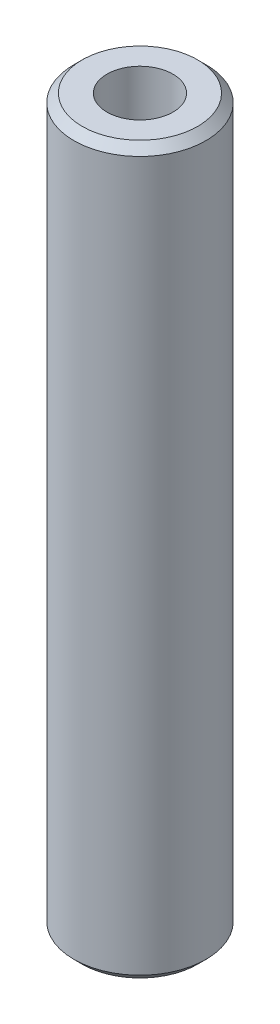
ISO-10303-21;
HEADER;
FILE_DESCRIPTION(('STEP AP214'),'2;1');
FILE_NAME('part.step','',(''),(''),'','','');
FILE_SCHEMA(('AUTOMOTIVE_DESIGN { 1 0 10303 214 1 1 1 1 }'));
ENDSEC;
DATA;
#1=APPLICATION_CONTEXT('core data for automotive mechanical design processes');
#2=APPLICATION_PROTOCOL_DEFINITION('international standard','automotive_design',2000,#1);
#3=PRODUCT_CONTEXT('',#1,'mechanical');
#4=PRODUCT('Part','Part','',(#3));
#5=PRODUCT_RELATED_PRODUCT_CATEGORY('part','',(#4));
#6=PRODUCT_DEFINITION_FORMATION('','',#4);
#7=PRODUCT_DEFINITION_CONTEXT('part definition',#1,'design');
#8=PRODUCT_DEFINITION('design','',#6,#7);
#9=PRODUCT_DEFINITION_SHAPE('','',#8);
#10=(LENGTH_UNIT() NAMED_UNIT(*) SI_UNIT(.MILLI.,.METRE.));
#11=(NAMED_UNIT(*) PLANE_ANGLE_UNIT() SI_UNIT($,.RADIAN.));
#12=(NAMED_UNIT(*) SI_UNIT($,.STERADIAN.) SOLID_ANGLE_UNIT());
#13=UNCERTAINTY_MEASURE_WITH_UNIT(LENGTH_MEASURE(1.E-05),#10,'distance_accuracy_value','');
#14=(GEOMETRIC_REPRESENTATION_CONTEXT(3) GLOBAL_UNCERTAINTY_ASSIGNED_CONTEXT((#13)) GLOBAL_UNIT_ASSIGNED_CONTEXT((#10,
#11,#12)) REPRESENTATION_CONTEXT('',''));
#15=CARTESIAN_POINT('',(0.,0.,0.));
#16=DIRECTION('',(0.,0.,1.));
#17=DIRECTION('',(1.,0.,0.));
#18=AXIS2_PLACEMENT_3D('',#15,#16,#17);
#19=CARTESIAN_POINT('',(0.,44.,0.));
#20=DIRECTION('',(0.,1.,0.));
#21=DIRECTION('',(0.,0.,1.));
#22=AXIS2_PLACEMENT_3D('',#19,#20,#21);
#23=PLANE('',#22);
#24=CARTESIAN_POINT('',(0.,44.,0.));
#25=DIRECTION('',(0.,1.,0.));
#26=DIRECTION('',(0.,0.,1.));
#27=AXIS2_PLACEMENT_3D('',#24,#25,#26);
#28=CIRCLE('',#27,3.5);
#29=CARTESIAN_POINT('',(0.,44.,3.5));
#30=VERTEX_POINT('',#29);
#31=EDGE_CURVE('E10',#30,#30,#28,.T.);
#32=ORIENTED_EDGE('',*,*,#31,.T.);
#33=EDGE_LOOP('',(#32));
#34=FACE_BOUND('',#33,.T.);
#35=CARTESIAN_POINT('',(0.,44.,0.));
#36=DIRECTION('',(0.,1.,0.));
#37=DIRECTION('',(0.,0.,1.));
#38=AXIS2_PLACEMENT_3D('',#35,#36,#37);
#39=CIRCLE('',#38,2.);
#40=CARTESIAN_POINT('',(0.,44.,2.));
#41=VERTEX_POINT('',#40);
#42=EDGE_CURVE('E60',#41,#41,#39,.T.);
#43=ORIENTED_EDGE('',*,*,#42,.F.);
#44=EDGE_LOOP('',(#43));
#45=FACE_BOUND('',#44,.T.);
#46=ADVANCED_FACE('F39',(#34,#45),#23,.T.);
#47=CARTESIAN_POINT('',(0.,0.,0.));
#48=DIRECTION('',(0.,1.,0.));
#49=DIRECTION('',(0.,0.,1.));
#50=AXIS2_PLACEMENT_3D('',#47,#48,#49);
#51=PLANE('',#50);
#52=CARTESIAN_POINT('',(0.,0.,0.));
#53=DIRECTION('',(0.,1.,0.));
#54=DIRECTION('',(0.,0.,1.));
#55=AXIS2_PLACEMENT_3D('',#52,#53,#54);
#56=CIRCLE('',#55,3.5);
#57=CARTESIAN_POINT('',(0.,0.,3.5));
#58=VERTEX_POINT('',#57);
#59=EDGE_CURVE('E47',#58,#58,#56,.F.);
#60=ORIENTED_EDGE('',*,*,#59,.T.);
#61=EDGE_LOOP('',(#60));
#62=FACE_BOUND('',#61,.T.);
#63=CARTESIAN_POINT('',(0.,0.,0.));
#64=DIRECTION('',(0.,1.,0.));
#65=DIRECTION('',(0.,0.,1.));
#66=AXIS2_PLACEMENT_3D('',#63,#64,#65);
#67=CIRCLE('',#66,2.);
#68=CARTESIAN_POINT('',(0.,0.,2.));
#69=VERTEX_POINT('',#68);
#70=EDGE_CURVE('E61',#69,#69,#67,.T.);
#71=ORIENTED_EDGE('',*,*,#70,.T.);
#72=EDGE_LOOP('',(#71));
#73=FACE_BOUND('',#72,.T.);
#74=ADVANCED_FACE('F71',(#62,#73),#51,.F.);
#75=CARTESIAN_POINT('',(0.,44.,0.));
#76=DIRECTION('',(0.,-1.,0.));
#77=DIRECTION('',(0.,0.,-1.));
#78=AXIS2_PLACEMENT_3D('',#75,#76,#77);
#79=CYLINDRICAL_SURFACE('',#78,4.);
#80=CARTESIAN_POINT('',(0.,0.5,0.));
#81=DIRECTION('',(0.,1.,0.));
#82=DIRECTION('',(0.,0.,1.));
#83=AXIS2_PLACEMENT_3D('',#80,#81,#82);
#84=CIRCLE('',#83,4.);
#85=CARTESIAN_POINT('',(0.,0.5,4.));
#86=VERTEX_POINT('',#85);
#87=EDGE_CURVE('E51',#86,#86,#84,.T.);
#88=ORIENTED_EDGE('',*,*,#87,.T.);
#89=EDGE_LOOP('',(#88));
#90=FACE_BOUND('',#89,.T.);
#91=CARTESIAN_POINT('',(0.,43.5,0.));
#92=DIRECTION('',(0.,1.,0.));
#93=DIRECTION('',(0.,0.,1.));
#94=AXIS2_PLACEMENT_3D('',#91,#92,#93);
#95=CIRCLE('',#94,4.);
#96=CARTESIAN_POINT('',(0.,43.5,4.));
#97=VERTEX_POINT('',#96);
#98=EDGE_CURVE('E55',#97,#97,#95,.F.);
#99=ORIENTED_EDGE('',*,*,#98,.T.);
#100=EDGE_LOOP('',(#99));
#101=FACE_BOUND('',#100,.T.);
#102=ADVANCED_FACE('F77',(#90,#101),#79,.T.);
#103=CARTESIAN_POINT('',(0.,44.,0.));
#104=DIRECTION('',(0.,-1.,0.));
#105=DIRECTION('',(0.,0.,-1.));
#106=AXIS2_PLACEMENT_3D('',#103,#104,#105);
#107=CYLINDRICAL_SURFACE('',#106,2.);
#108=ORIENTED_EDGE('',*,*,#42,.T.);
#109=EDGE_LOOP('',(#108));
#110=FACE_BOUND('',#109,.T.);
#111=ORIENTED_EDGE('',*,*,#70,.F.);
#112=EDGE_LOOP('',(#111));
#113=FACE_BOUND('',#112,.T.);
#114=ADVANCED_FACE('F67',(#110,#113),#107,.F.);
#115=CARTESIAN_POINT('',(0.,0.5,0.));
#116=DIRECTION('',(0.,1.,0.));
#117=DIRECTION('',(0.,0.,1.));
#118=AXIS2_PLACEMENT_3D('',#115,#116,#117);
#119=CONICAL_SURFACE('',#118,4.,0.785398163397445);
#120=ORIENTED_EDGE('',*,*,#59,.F.);
#121=EDGE_LOOP('',(#120));
#122=FACE_BOUND('',#121,.T.);
#123=ORIENTED_EDGE('',*,*,#87,.F.);
#124=EDGE_LOOP('',(#123));
#125=FACE_BOUND('',#124,.T.);
#126=ADVANCED_FACE('F84',(#122,#125),#119,.T.);
#127=CARTESIAN_POINT('',(0.,44.,0.));
#128=DIRECTION('',(0.,-1.,0.));
#129=DIRECTION('',(0.,0.,-1.));
#130=AXIS2_PLACEMENT_3D('',#127,#128,#129);
#131=CONICAL_SURFACE('',#130,3.5,0.785398163397452);
#132=ORIENTED_EDGE('',*,*,#98,.F.);
#133=EDGE_LOOP('',(#132));
#134=FACE_BOUND('',#133,.T.);
#135=ORIENTED_EDGE('',*,*,#31,.F.);
#136=EDGE_LOOP('',(#135));
#137=FACE_BOUND('',#136,.T.);
#138=ADVANCED_FACE('F42',(#134,#137),#131,.T.);
#139=CLOSED_SHELL('',(#46,#74,#102,#114,#126,#138));
#140=MANIFOLD_SOLID_BREP('B2',#139);
#141=ADVANCED_BREP_SHAPE_REPRESENTATION('',(#18,#140),#14);
#142=SHAPE_DEFINITION_REPRESENTATION(#9,#141);
ENDSEC;
END-ISO-10303-21;
